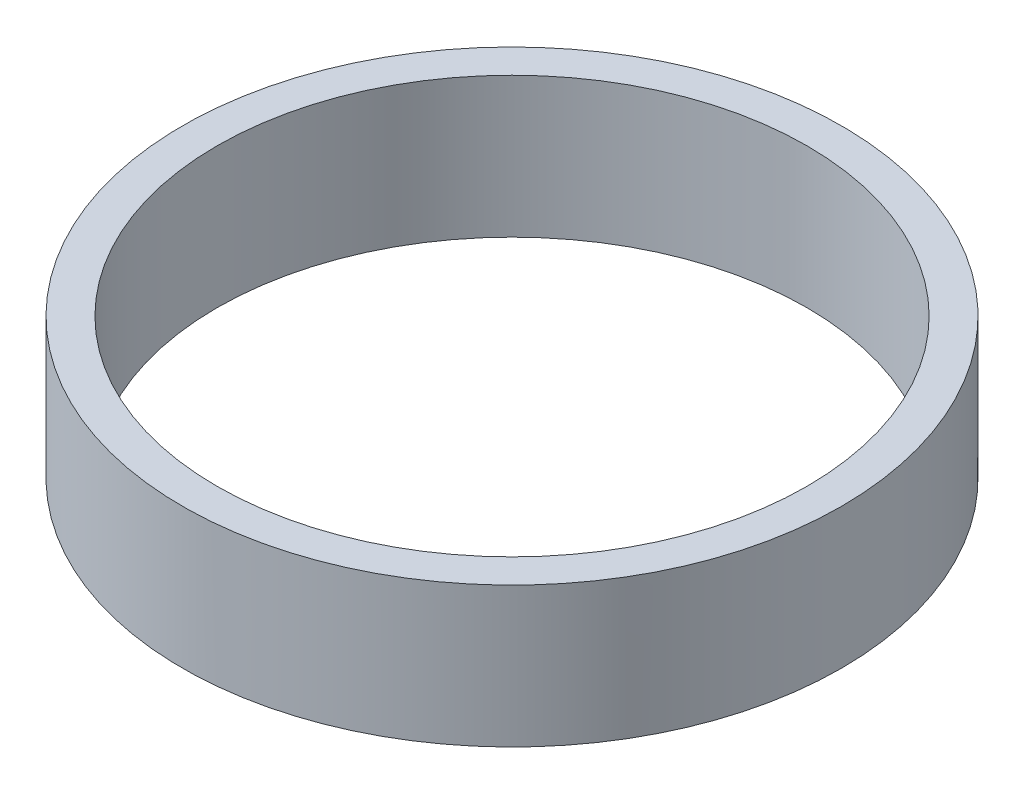
ISO-10303-21;
HEADER;
FILE_DESCRIPTION(('STEP AP214'),'2;1');
FILE_NAME('part.step','',(''),(''),'','','');
FILE_SCHEMA(('AUTOMOTIVE_DESIGN { 1 0 10303 214 1 1 1 1 }'));
ENDSEC;
DATA;
#1=APPLICATION_CONTEXT('core data for automotive mechanical design processes');
#2=APPLICATION_PROTOCOL_DEFINITION('international standard','automotive_design',2000,#1);
#3=PRODUCT_CONTEXT('',#1,'mechanical');
#4=PRODUCT('Part','Part','',(#3));
#5=PRODUCT_RELATED_PRODUCT_CATEGORY('part','',(#4));
#6=PRODUCT_DEFINITION_FORMATION('','',#4);
#7=PRODUCT_DEFINITION_CONTEXT('part definition',#1,'design');
#8=PRODUCT_DEFINITION('design','',#6,#7);
#9=PRODUCT_DEFINITION_SHAPE('','',#8);
#10=(LENGTH_UNIT() NAMED_UNIT(*) SI_UNIT(.MILLI.,.METRE.));
#11=(NAMED_UNIT(*) PLANE_ANGLE_UNIT() SI_UNIT($,.RADIAN.));
#12=(NAMED_UNIT(*) SI_UNIT($,.STERADIAN.) SOLID_ANGLE_UNIT());
#13=UNCERTAINTY_MEASURE_WITH_UNIT(LENGTH_MEASURE(1.E-05),#10,'distance_accuracy_value','');
#14=(GEOMETRIC_REPRESENTATION_CONTEXT(3) GLOBAL_UNCERTAINTY_ASSIGNED_CONTEXT((#13)) GLOBAL_UNIT_ASSIGNED_CONTEXT((#10,
#11,#12)) REPRESENTATION_CONTEXT('',''));
#15=CARTESIAN_POINT('',(0.,0.,0.));
#16=DIRECTION('',(0.,0.,1.));
#17=DIRECTION('',(1.,0.,0.));
#18=AXIS2_PLACEMENT_3D('',#15,#16,#17);
#19=CARTESIAN_POINT('',(0.,0.,0.));
#20=DIRECTION('',(0.,1.,0.));
#21=DIRECTION('',(1.,0.,0.));
#22=AXIS2_PLACEMENT_3D('',#19,#20,#21);
#23=CYLINDRICAL_SURFACE('',#22,35.25);
#24=CARTESIAN_POINT('',(0.,13.5,0.));
#25=DIRECTION('',(0.,-1.,0.));
#26=DIRECTION('',(1.,0.,0.));
#27=AXIS2_PLACEMENT_3D('',#24,#25,#26);
#28=CIRCLE('',#27,35.25);
#29=CARTESIAN_POINT('',(35.25,13.5,0.));
#30=VERTEX_POINT('',#29);
#31=EDGE_CURVE('E9',#30,#30,#28,.T.);
#32=ORIENTED_EDGE('',*,*,#31,.T.);
#33=EDGE_LOOP('',(#32));
#34=FACE_BOUND('',#33,.T.);
#35=CARTESIAN_POINT('',(0.,-1.5,0.));
#36=DIRECTION('',(0.,1.,0.));
#37=DIRECTION('',(-1.,0.,0.));
#38=AXIS2_PLACEMENT_3D('',#35,#36,#37);
#39=CIRCLE('',#38,35.25);
#40=CARTESIAN_POINT('',(-35.25,-1.5,0.));
#41=VERTEX_POINT('',#40);
#42=EDGE_CURVE('E37',#41,#41,#39,.T.);
#43=ORIENTED_EDGE('',*,*,#42,.T.);
#44=EDGE_LOOP('',(#43));
#45=FACE_BOUND('',#44,.T.);
#46=ADVANCED_FACE('F14',(#34,#45),#23,.T.);
#47=CARTESIAN_POINT('',(0.,13.5,0.));
#48=DIRECTION('',(0.,1.,0.));
#49=DIRECTION('',(1.,0.,0.));
#50=AXIS2_PLACEMENT_3D('',#47,#48,#49);
#51=PLANE('',#50);
#52=CARTESIAN_POINT('',(0.,13.5,0.));
#53=DIRECTION('',(0.,1.,0.));
#54=DIRECTION('',(0.,0.,-1.));
#55=AXIS2_PLACEMENT_3D('',#52,#53,#54);
#56=CIRCLE('',#55,31.55);
#57=CARTESIAN_POINT('',(0.,13.5,-31.55));
#58=VERTEX_POINT('',#57);
#59=EDGE_CURVE('E21',#58,#58,#56,.T.);
#60=ORIENTED_EDGE('',*,*,#59,.F.);
#61=EDGE_LOOP('',(#60));
#62=FACE_BOUND('',#61,.T.);
#63=ORIENTED_EDGE('',*,*,#31,.F.);
#64=EDGE_LOOP('',(#63));
#65=FACE_BOUND('',#64,.T.);
#66=ADVANCED_FACE('F56',(#62,#65),#51,.T.);
#67=CARTESIAN_POINT('',(0.,0.,0.));
#68=DIRECTION('',(0.,-1.,0.));
#69=DIRECTION('',(0.,0.,-1.));
#70=AXIS2_PLACEMENT_3D('',#67,#68,#69);
#71=CYLINDRICAL_SURFACE('',#70,31.55);
#72=ORIENTED_EDGE('',*,*,#59,.T.);
#73=EDGE_LOOP('',(#72));
#74=FACE_BOUND('',#73,.T.);
#75=CARTESIAN_POINT('',(0.,-1.5,0.));
#76=DIRECTION('',(0.,1.,0.));
#77=DIRECTION('',(0.,0.,1.));
#78=AXIS2_PLACEMENT_3D('',#75,#76,#77);
#79=CIRCLE('',#78,31.55);
#80=CARTESIAN_POINT('',(0.,-1.5,31.55));
#81=VERTEX_POINT('',#80);
#82=EDGE_CURVE('E30',#81,#81,#79,.T.);
#83=ORIENTED_EDGE('',*,*,#82,.F.);
#84=EDGE_LOOP('',(#83));
#85=FACE_BOUND('',#84,.T.);
#86=ADVANCED_FACE('F49',(#74,#85),#71,.F.);
#87=CARTESIAN_POINT('',(0.,-1.5,0.));
#88=DIRECTION('',(0.,1.,0.));
#89=DIRECTION('',(1.,0.,0.));
#90=AXIS2_PLACEMENT_3D('',#87,#88,#89);
#91=PLANE('',#90);
#92=ORIENTED_EDGE('',*,*,#82,.T.);
#93=EDGE_LOOP('',(#92));
#94=FACE_BOUND('',#93,.T.);
#95=ORIENTED_EDGE('',*,*,#42,.F.);
#96=EDGE_LOOP('',(#95));
#97=FACE_BOUND('',#96,.T.);
#98=ADVANCED_FACE('F47',(#94,#97),#91,.F.);
#99=CLOSED_SHELL('',(#46,#66,#86,#98));
#100=MANIFOLD_SOLID_BREP('B1',#99);
#101=ADVANCED_BREP_SHAPE_REPRESENTATION('',(#18,#100),#14);
#102=SHAPE_DEFINITION_REPRESENTATION(#9,#101);
ENDSEC;
END-ISO-10303-21;
